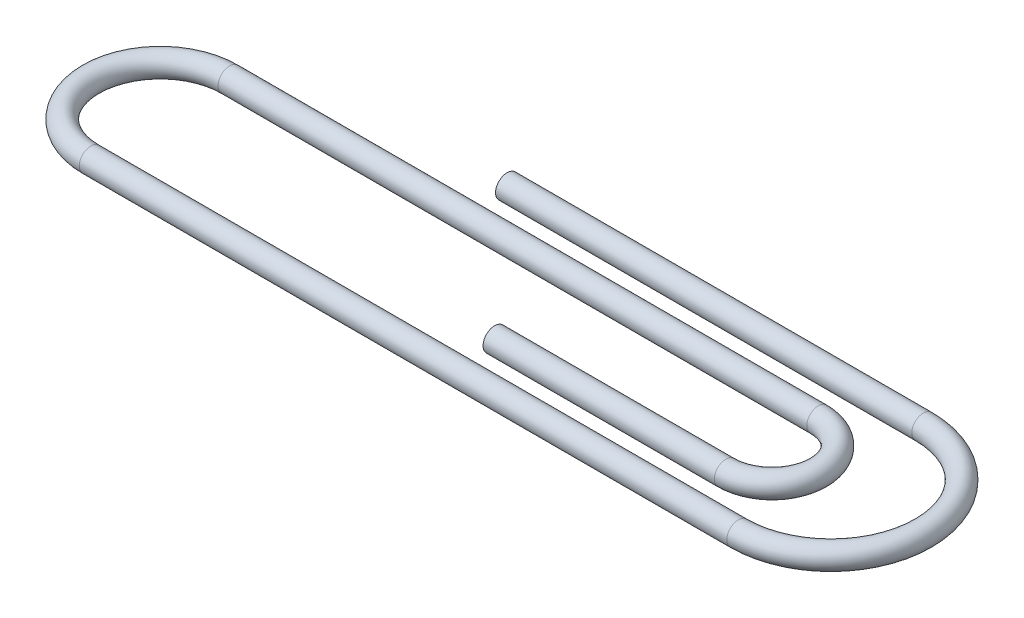
ISO-10303-21;
HEADER;
FILE_DESCRIPTION(('STEP AP214'),'2;1');
FILE_NAME('part.step','',(''),(''),'','','');
FILE_SCHEMA(('AUTOMOTIVE_DESIGN { 1 0 10303 214 1 1 1 1 }'));
ENDSEC;
DATA;
#1=APPLICATION_CONTEXT('core data for automotive mechanical design processes');
#2=APPLICATION_PROTOCOL_DEFINITION('international standard','automotive_design',2000,#1);
#3=PRODUCT_CONTEXT('',#1,'mechanical');
#4=PRODUCT('Part','Part','',(#3));
#5=PRODUCT_RELATED_PRODUCT_CATEGORY('part','',(#4));
#6=PRODUCT_DEFINITION_FORMATION('','',#4);
#7=PRODUCT_DEFINITION_CONTEXT('part definition',#1,'design');
#8=PRODUCT_DEFINITION('design','',#6,#7);
#9=PRODUCT_DEFINITION_SHAPE('','',#8);
#10=(LENGTH_UNIT() NAMED_UNIT(*) SI_UNIT(.MILLI.,.METRE.));
#11=(NAMED_UNIT(*) PLANE_ANGLE_UNIT() SI_UNIT($,.RADIAN.));
#12=(NAMED_UNIT(*) SI_UNIT($,.STERADIAN.) SOLID_ANGLE_UNIT());
#13=UNCERTAINTY_MEASURE_WITH_UNIT(LENGTH_MEASURE(1.E-05),#10,'distance_accuracy_value','');
#14=(GEOMETRIC_REPRESENTATION_CONTEXT(3) GLOBAL_UNCERTAINTY_ASSIGNED_CONTEXT((#13)) GLOBAL_UNIT_ASSIGNED_CONTEXT((#10,
#11,#12)) REPRESENTATION_CONTEXT('',''));
#15=CARTESIAN_POINT('',(0.,0.,0.));
#16=DIRECTION('',(0.,0.,1.));
#17=DIRECTION('',(1.,0.,0.));
#18=AXIS2_PLACEMENT_3D('',#15,#16,#17);
#19=CARTESIAN_POINT('',(0.,0.,0.));
#20=DIRECTION('',(-1.,0.,0.));
#21=DIRECTION('',(0.,0.,1.));
#22=AXIS2_PLACEMENT_3D('',#19,#20,#21);
#23=PLANE('',#22);
#24=CARTESIAN_POINT('',(0.,0.,0.));
#25=DIRECTION('',(-1.,0.,0.));
#26=DIRECTION('',(0.,0.,1.));
#27=AXIS2_PLACEMENT_3D('',#24,#25,#26);
#28=CIRCLE('',#27,0.5);
#29=CARTESIAN_POINT('',(0.,0.,0.5));
#30=VERTEX_POINT('',#29);
#31=EDGE_CURVE('E80',#30,#30,#28,.T.);
#32=ORIENTED_EDGE('',*,*,#31,.T.);
#33=EDGE_LOOP('',(#32));
#34=FACE_BOUND('',#33,.T.);
#35=ADVANCED_FACE('F47',(#34),#23,.T.);
#36=CARTESIAN_POINT('',(5.46032736431913,0.,6.));
#37=DIRECTION('',(1.,0.,0.));
#38=DIRECTION('',(0.,0.,-1.));
#39=AXIS2_PLACEMENT_3D('',#36,#37,#38);
#40=PLANE('',#39);
#41=CARTESIAN_POINT('',(5.46032736431913,0.,6.));
#42=DIRECTION('',(1.,0.,0.));
#43=DIRECTION('',(0.,0.,-1.));
#44=AXIS2_PLACEMENT_3D('',#41,#42,#43);
#45=CIRCLE('',#44,0.5);
#46=CARTESIAN_POINT('',(5.46032736431913,0.,5.5));
#47=VERTEX_POINT('',#46);
#48=EDGE_CURVE('E11',#47,#47,#45,.T.);
#49=ORIENTED_EDGE('',*,*,#48,.F.);
#50=EDGE_LOOP('',(#49));
#51=FACE_BOUND('',#50,.T.);
#52=ADVANCED_FACE('F82',(#51),#40,.F.);
#53=CARTESIAN_POINT('',(0.,0.,0.));
#54=DIRECTION('',(1.,0.,0.));
#55=DIRECTION('',(0.,0.,-1.));
#56=AXIS2_PLACEMENT_3D('',#53,#54,#55);
#57=CYLINDRICAL_SURFACE('',#56,0.5);
#58=CARTESIAN_POINT('',(18.,0.,0.));
#59=DIRECTION('',(-1.,0.,0.));
#60=DIRECTION('',(0.,0.,1.));
#61=AXIS2_PLACEMENT_3D('',#58,#59,#60);
#62=CIRCLE('',#61,0.5);
#63=CARTESIAN_POINT('',(18.,0.,-0.5));
#64=VERTEX_POINT('',#63);
#65=EDGE_CURVE('E74',#64,#64,#62,.T.);
#66=ORIENTED_EDGE('',*,*,#65,.T.);
#67=EDGE_LOOP('',(#66));
#68=FACE_BOUND('',#67,.T.);
#69=ORIENTED_EDGE('',*,*,#31,.F.);
#70=EDGE_LOOP('',(#69));
#71=FACE_BOUND('',#70,.T.);
#72=ADVANCED_FACE('F81',(#68,#71),#57,.T.);
#73=CARTESIAN_POINT('',(18.,0.,4.));
#74=DIRECTION('',(0.,-1.,0.));
#75=DIRECTION('',(0.,0.,-1.));
#76=AXIS2_PLACEMENT_3D('',#73,#74,#75);
#77=TOROIDAL_SURFACE('',#76,4.,0.5);
#78=CARTESIAN_POINT('',(18.,0.,8.));
#79=DIRECTION('',(1.,0.,0.));
#80=DIRECTION('',(0.,0.,-1.));
#81=AXIS2_PLACEMENT_3D('',#78,#79,#80);
#82=CIRCLE('',#81,0.5);
#83=CARTESIAN_POINT('',(18.,0.,8.5));
#84=VERTEX_POINT('',#83);
#85=EDGE_CURVE('E72',#84,#84,#82,.T.);
#86=CARTESIAN_POINT('',(18.,0.,4.));
#87=DIRECTION('',(0.,-1.,0.));
#88=DIRECTION('',(0.,0.,-1.));
#89=AXIS2_PLACEMENT_3D('',#86,#87,#88);
#90=CIRCLE('',#89,4.5);
#91=EDGE_CURVE('',#64,#84,#90,.T.);
#92=ORIENTED_EDGE('',*,*,#65,.F.);
#93=ORIENTED_EDGE('',*,*,#85,.T.);
#94=ORIENTED_EDGE('',*,*,#91,.T.);
#95=ORIENTED_EDGE('',*,*,#91,.F.);
#96=EDGE_LOOP('',(#92,#94,#93,#95));
#97=FACE_BOUND('',#96,.T.);
#98=ADVANCED_FACE('F83',(#97),#77,.T.);
#99=CARTESIAN_POINT('',(18.,0.,8.));
#100=DIRECTION('',(-1.,0.,0.));
#101=DIRECTION('',(0.,0.,1.));
#102=AXIS2_PLACEMENT_3D('',#99,#100,#101);
#103=CYLINDRICAL_SURFACE('',#102,0.5);
#104=CARTESIAN_POINT('',(-10.,0.,8.));
#105=DIRECTION('',(1.,0.,0.));
#106=DIRECTION('',(0.,0.,-1.));
#107=AXIS2_PLACEMENT_3D('',#104,#105,#106);
#108=CIRCLE('',#107,0.5);
#109=CARTESIAN_POINT('',(-10.,0.,8.49999999999999));
#110=VERTEX_POINT('',#109);
#111=EDGE_CURVE('E70',#110,#110,#108,.T.);
#112=ORIENTED_EDGE('',*,*,#111,.T.);
#113=EDGE_LOOP('',(#112));
#114=FACE_BOUND('',#113,.T.);
#115=ORIENTED_EDGE('',*,*,#85,.F.);
#116=EDGE_LOOP('',(#115));
#117=FACE_BOUND('',#116,.T.);
#118=ADVANCED_FACE('F95',(#114,#117),#103,.T.);
#119=CARTESIAN_POINT('',(-10.,0.,5.));
#120=DIRECTION('',(0.,-1.,0.));
#121=DIRECTION('',(0.,0.,-1.));
#122=AXIS2_PLACEMENT_3D('',#119,#120,#121);
#123=TOROIDAL_SURFACE('',#122,2.99999999999999,0.5);
#124=CARTESIAN_POINT('',(-10.,0.,2.));
#125=DIRECTION('',(-1.,0.,0.));
#126=DIRECTION('',(0.,0.,1.));
#127=AXIS2_PLACEMENT_3D('',#124,#125,#126);
#128=CIRCLE('',#127,0.5);
#129=CARTESIAN_POINT('',(-10.,0.,1.50000000000001));
#130=VERTEX_POINT('',#129);
#131=EDGE_CURVE('E64',#130,#130,#128,.T.);
#132=CARTESIAN_POINT('',(-10.,0.,5.));
#133=DIRECTION('',(0.,-1.,0.));
#134=DIRECTION('',(0.,0.,-1.));
#135=AXIS2_PLACEMENT_3D('',#132,#133,#134);
#136=CIRCLE('',#135,3.49999999999999);
#137=EDGE_CURVE('',#110,#130,#136,.T.);
#138=ORIENTED_EDGE('',*,*,#111,.F.);
#139=ORIENTED_EDGE('',*,*,#131,.T.);
#140=ORIENTED_EDGE('',*,*,#137,.T.);
#141=ORIENTED_EDGE('',*,*,#137,.F.);
#142=EDGE_LOOP('',(#138,#140,#139,#141));
#143=FACE_BOUND('',#142,.T.);
#144=ADVANCED_FACE('F108',(#143),#123,.T.);
#145=CARTESIAN_POINT('',(-10.,0.,2.));
#146=DIRECTION('',(1.,0.,0.));
#147=DIRECTION('',(0.,0.,-1.));
#148=AXIS2_PLACEMENT_3D('',#145,#146,#147);
#149=CYLINDRICAL_SURFACE('',#148,0.5);
#150=CARTESIAN_POINT('',(15.4603273643191,0.,2.));
#151=DIRECTION('',(-1.,0.,0.));
#152=DIRECTION('',(0.,0.,1.));
#153=AXIS2_PLACEMENT_3D('',#150,#151,#152);
#154=CIRCLE('',#153,0.5);
#155=CARTESIAN_POINT('',(15.4603273643191,0.,1.5));
#156=VERTEX_POINT('',#155);
#157=EDGE_CURVE('E56',#156,#156,#154,.T.);
#158=ORIENTED_EDGE('',*,*,#157,.T.);
#159=EDGE_LOOP('',(#158));
#160=FACE_BOUND('',#159,.T.);
#161=ORIENTED_EDGE('',*,*,#131,.F.);
#162=EDGE_LOOP('',(#161));
#163=FACE_BOUND('',#162,.T.);
#164=ADVANCED_FACE('F103',(#160,#163),#149,.T.);
#165=CARTESIAN_POINT('',(15.4603273643191,0.,4.));
#166=DIRECTION('',(0.,-1.,0.));
#167=DIRECTION('',(0.,0.,-1.));
#168=AXIS2_PLACEMENT_3D('',#165,#166,#167);
#169=TOROIDAL_SURFACE('',#168,2.,0.5);
#170=CARTESIAN_POINT('',(15.4603273643191,0.,6.));
#171=DIRECTION('',(1.,0.,0.));
#172=DIRECTION('',(0.,0.,-1.));
#173=AXIS2_PLACEMENT_3D('',#170,#171,#172);
#174=CIRCLE('',#173,0.5);
#175=CARTESIAN_POINT('',(15.4603273643191,0.,6.5));
#176=VERTEX_POINT('',#175);
#177=EDGE_CURVE('E54',#176,#176,#174,.T.);
#178=CARTESIAN_POINT('',(15.4603273643191,0.,4.));
#179=DIRECTION('',(0.,-1.,0.));
#180=DIRECTION('',(0.,0.,-1.));
#181=AXIS2_PLACEMENT_3D('',#178,#179,#180);
#182=CIRCLE('',#181,2.5);
#183=EDGE_CURVE('',#156,#176,#182,.T.);
#184=ORIENTED_EDGE('',*,*,#157,.F.);
#185=ORIENTED_EDGE('',*,*,#177,.T.);
#186=ORIENTED_EDGE('',*,*,#183,.T.);
#187=ORIENTED_EDGE('',*,*,#183,.F.);
#188=EDGE_LOOP('',(#184,#186,#185,#187));
#189=FACE_BOUND('',#188,.T.);
#190=ADVANCED_FACE('F98',(#189),#169,.T.);
#191=CARTESIAN_POINT('',(15.4603273643191,0.,6.));
#192=DIRECTION('',(-1.,0.,0.));
#193=DIRECTION('',(0.,0.,1.));
#194=AXIS2_PLACEMENT_3D('',#191,#192,#193);
#195=CYLINDRICAL_SURFACE('',#194,0.5);
#196=ORIENTED_EDGE('',*,*,#48,.T.);
#197=EDGE_LOOP('',(#196));
#198=FACE_BOUND('',#197,.T.);
#199=ORIENTED_EDGE('',*,*,#177,.F.);
#200=EDGE_LOOP('',(#199));
#201=FACE_BOUND('',#200,.T.);
#202=ADVANCED_FACE('F96',(#198,#201),#195,.T.);
#203=CLOSED_SHELL('',(#35,#52,#72,#98,#118,#144,#164,#190,#202));
#204=MANIFOLD_SOLID_BREP('B2',#203);
#205=ADVANCED_BREP_SHAPE_REPRESENTATION('',(#18,#204),#14);
#206=SHAPE_DEFINITION_REPRESENTATION(#9,#205);
ENDSEC;
END-ISO-10303-21;
